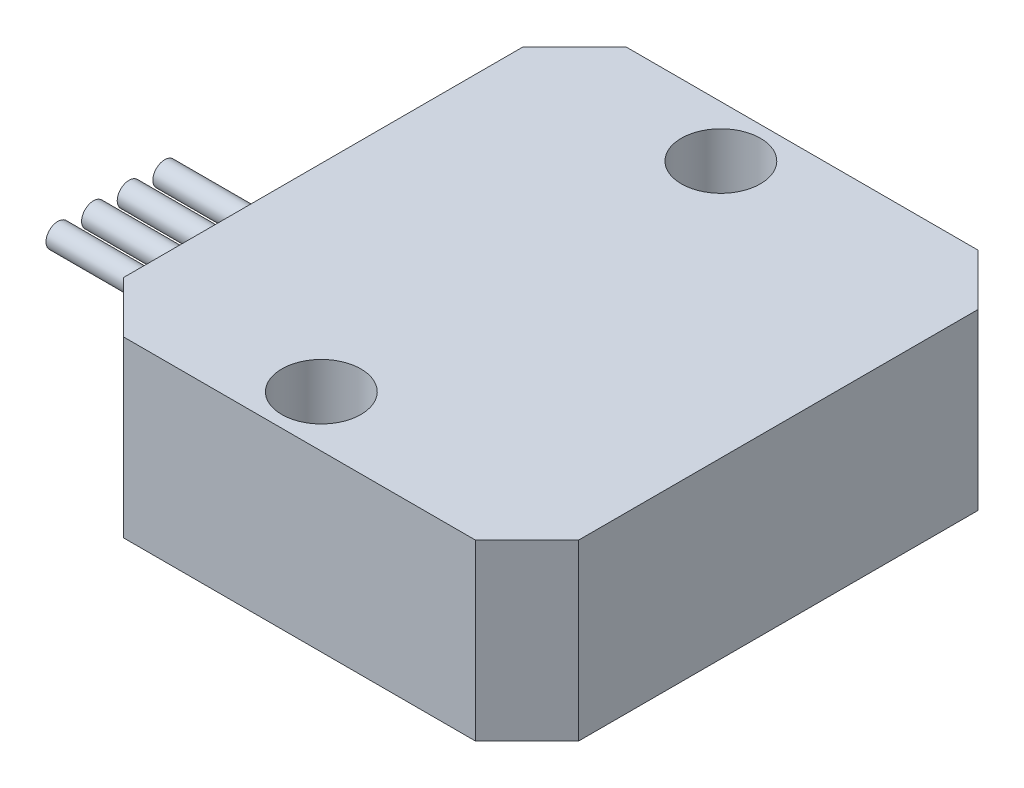
ISO-10303-21;
HEADER;
FILE_DESCRIPTION(('STEP AP214'),'2;1');
FILE_NAME('part.step','',(''),(''),'','','');
FILE_SCHEMA(('AUTOMOTIVE_DESIGN { 1 0 10303 214 1 1 1 1 }'));
ENDSEC;
DATA;
#1=APPLICATION_CONTEXT('core data for automotive mechanical design processes');
#2=APPLICATION_PROTOCOL_DEFINITION('international standard','automotive_design',2000,#1);
#3=PRODUCT_CONTEXT('',#1,'mechanical');
#4=PRODUCT('Part','Part','',(#3));
#5=PRODUCT_RELATED_PRODUCT_CATEGORY('part','',(#4));
#6=PRODUCT_DEFINITION_FORMATION('','',#4);
#7=PRODUCT_DEFINITION_CONTEXT('part definition',#1,'design');
#8=PRODUCT_DEFINITION('design','',#6,#7);
#9=PRODUCT_DEFINITION_SHAPE('','',#8);
#10=(LENGTH_UNIT() NAMED_UNIT(*) SI_UNIT(.MILLI.,.METRE.));
#11=(NAMED_UNIT(*) PLANE_ANGLE_UNIT() SI_UNIT($,.RADIAN.));
#12=(NAMED_UNIT(*) SI_UNIT($,.STERADIAN.) SOLID_ANGLE_UNIT());
#13=UNCERTAINTY_MEASURE_WITH_UNIT(LENGTH_MEASURE(1.E-05),#10,'distance_accuracy_value','');
#14=(GEOMETRIC_REPRESENTATION_CONTEXT(3) GLOBAL_UNCERTAINTY_ASSIGNED_CONTEXT((#13)) GLOBAL_UNIT_ASSIGNED_CONTEXT((#10,
#11,#12)) REPRESENTATION_CONTEXT('',''));
#15=CARTESIAN_POINT('',(0.,0.,0.));
#16=DIRECTION('',(0.,0.,1.));
#17=DIRECTION('',(1.,0.,0.));
#18=AXIS2_PLACEMENT_3D('',#15,#16,#17);
#19=CARTESIAN_POINT('',(-28.75,22.,25.25));
#20=DIRECTION('',(1.,0.,0.));
#21=DIRECTION('',(0.,0.,-1.));
#22=AXIS2_PLACEMENT_3D('',#19,#20,#21);
#23=PLANE('',#22);
#24=DIRECTION('',(0.,-1.,0.));
#25=VECTOR('',#24,1.);
#26=CARTESIAN_POINT('',(-28.75,0.,-13.75));
#27=LINE('',#26,#25);
#28=CARTESIAN_POINT('',(-28.75,14.5,-13.75));
#29=VERTEX_POINT('',#28);
#30=CARTESIAN_POINT('',(-28.75,0.,-13.75));
#31=VERTEX_POINT('',#30);
#32=EDGE_CURVE('E52',#29,#31,#27,.T.);
#33=ORIENTED_EDGE('',*,*,#32,.F.);
#34=DIRECTION('',(0.,0.,-1.));
#35=VECTOR('',#34,1.);
#36=CARTESIAN_POINT('',(-28.75,14.5,-13.75));
#37=LINE('',#36,#35);
#38=CARTESIAN_POINT('',(-28.75,14.5,13.75));
#39=VERTEX_POINT('',#38);
#40=EDGE_CURVE('E147',#39,#29,#37,.T.);
#41=ORIENTED_EDGE('',*,*,#40,.F.);
#42=DIRECTION('',(0.,1.,0.));
#43=VECTOR('',#42,1.);
#44=CARTESIAN_POINT('',(-28.75,0.,13.75));
#45=LINE('',#44,#43);
#46=CARTESIAN_POINT('',(-28.75,0.,13.75));
#47=VERTEX_POINT('',#46);
#48=EDGE_CURVE('E58',#47,#39,#45,.T.);
#49=ORIENTED_EDGE('',*,*,#48,.F.);
#50=DIRECTION('',(0.,0.,1.));
#51=VECTOR('',#50,1.);
#52=CARTESIAN_POINT('',(-28.75,0.,25.25));
#53=LINE('',#52,#51);
#54=CARTESIAN_POINT('',(-28.75,0.,25.25));
#55=VERTEX_POINT('',#54);
#56=EDGE_CURVE('E197',#47,#55,#53,.T.);
#57=ORIENTED_EDGE('',*,*,#56,.T.);
#58=DIRECTION('',(0.,-1.,0.));
#59=VECTOR('',#58,1.);
#60=CARTESIAN_POINT('',(-28.75,22.,25.25));
#61=LINE('',#60,#59);
#62=CARTESIAN_POINT('',(-28.75,22.,25.25));
#63=VERTEX_POINT('',#62);
#64=EDGE_CURVE('E208',#63,#55,#61,.T.);
#65=ORIENTED_EDGE('',*,*,#64,.F.);
#66=DIRECTION('',(0.,0.,1.));
#67=VECTOR('',#66,1.);
#68=CARTESIAN_POINT('',(-28.75,22.,25.25));
#69=LINE('',#68,#67);
#70=CARTESIAN_POINT('',(-28.75,22.,-25.25));
#71=VERTEX_POINT('',#70);
#72=EDGE_CURVE('E180',#71,#63,#69,.T.);
#73=ORIENTED_EDGE('',*,*,#72,.F.);
#74=DIRECTION('',(0.,-1.,0.));
#75=VECTOR('',#74,1.);
#76=CARTESIAN_POINT('',(-28.75,22.,-25.25));
#77=LINE('',#76,#75);
#78=CARTESIAN_POINT('',(-28.75,0.,-25.25));
#79=VERTEX_POINT('',#78);
#80=EDGE_CURVE('E211',#71,#79,#77,.T.);
#81=ORIENTED_EDGE('',*,*,#80,.T.);
#82=EDGE_CURVE('E198',#79,#31,#53,.T.);
#83=ORIENTED_EDGE('',*,*,#82,.T.);
#84=EDGE_LOOP('',(#33,#41,#49,#57,#65,#73,#81,#83));
#85=FACE_BOUND('',#84,.T.);
#86=ADVANCED_FACE('F37',(#85),#23,.F.);
#87=CARTESIAN_POINT('',(0.,22.,0.));
#88=DIRECTION('',(0.,-1.,0.));
#89=DIRECTION('',(0.,0.,-1.));
#90=AXIS2_PLACEMENT_3D('',#87,#88,#89);
#91=PLANE('',#90);
#92=DIRECTION('',(0.707106781186548,0.,-0.707106781186547));
#93=VECTOR('',#92,1.);
#94=CARTESIAN_POINT('',(28.75,22.,25.25));
#95=LINE('',#94,#93);
#96=CARTESIAN_POINT('',(22.25,22.,31.75));
#97=VERTEX_POINT('',#96);
#98=CARTESIAN_POINT('',(28.75,22.,25.25));
#99=VERTEX_POINT('',#98);
#100=EDGE_CURVE('E168',#97,#99,#95,.T.);
#101=ORIENTED_EDGE('',*,*,#100,.T.);
#102=DIRECTION('',(0.,0.,-1.));
#103=VECTOR('',#102,1.);
#104=CARTESIAN_POINT('',(28.75,22.,-25.25));
#105=LINE('',#104,#103);
#106=CARTESIAN_POINT('',(28.75,22.,-25.25));
#107=VERTEX_POINT('',#106);
#108=EDGE_CURVE('E171',#99,#107,#105,.T.);
#109=ORIENTED_EDGE('',*,*,#108,.T.);
#110=DIRECTION('',(-0.707106781186544,0.,-0.707106781186551));
#111=VECTOR('',#110,1.);
#112=CARTESIAN_POINT('',(22.25,22.,-31.75));
#113=LINE('',#112,#111);
#114=CARTESIAN_POINT('',(22.25,22.,-31.75));
#115=VERTEX_POINT('',#114);
#116=EDGE_CURVE('E174',#107,#115,#113,.T.);
#117=ORIENTED_EDGE('',*,*,#116,.T.);
#118=DIRECTION('',(-1.,0.,0.));
#119=VECTOR('',#118,1.);
#120=CARTESIAN_POINT('',(-22.2499999999999,22.,-31.75));
#121=LINE('',#120,#119);
#122=CARTESIAN_POINT('',(-22.2499999999999,22.,-31.75));
#123=VERTEX_POINT('',#122);
#124=EDGE_CURVE('E176',#115,#123,#121,.T.);
#125=ORIENTED_EDGE('',*,*,#124,.T.);
#126=DIRECTION('',(-0.707106781186551,0.,0.707106781186544));
#127=VECTOR('',#126,1.);
#128=CARTESIAN_POINT('',(-28.75,22.,-25.25));
#129=LINE('',#128,#127);
#130=EDGE_CURVE('E178',#123,#71,#129,.T.);
#131=ORIENTED_EDGE('',*,*,#130,.T.);
#132=ORIENTED_EDGE('',*,*,#72,.T.);
#133=DIRECTION('',(0.707106781186545,0.,0.70710678118655));
#134=VECTOR('',#133,1.);
#135=CARTESIAN_POINT('',(-22.25,22.,31.75));
#136=LINE('',#135,#134);
#137=CARTESIAN_POINT('',(-22.25,22.,31.75));
#138=VERTEX_POINT('',#137);
#139=EDGE_CURVE('E182',#63,#138,#136,.T.);
#140=ORIENTED_EDGE('',*,*,#139,.T.);
#141=DIRECTION('',(1.,0.,0.));
#142=VECTOR('',#141,1.);
#143=CARTESIAN_POINT('',(22.25,22.,31.75));
#144=LINE('',#143,#142);
#145=EDGE_CURVE('E184',#138,#97,#144,.T.);
#146=ORIENTED_EDGE('',*,*,#145,.T.);
#147=EDGE_LOOP('',(#101,#109,#117,#125,#131,#132,#140,#146));
#148=FACE_BOUND('',#147,.T.);
#149=CARTESIAN_POINT('',(-3.74999999999999,22.,-25.25));
#150=DIRECTION('',(0.,1.,0.));
#151=DIRECTION('',(0.,0.,1.));
#152=AXIS2_PLACEMENT_3D('',#149,#150,#151);
#153=CIRCLE('',#152,5.);
#154=CARTESIAN_POINT('',(-3.74999999999999,22.,-20.25));
#155=VERTEX_POINT('',#154);
#156=EDGE_CURVE('E162',#155,#155,#153,.T.);
#157=ORIENTED_EDGE('',*,*,#156,.F.);
#158=EDGE_LOOP('',(#157));
#159=FACE_BOUND('',#158,.T.);
#160=CARTESIAN_POINT('',(-3.74999999999998,22.,25.25));
#161=DIRECTION('',(0.,1.,0.));
#162=DIRECTION('',(0.,0.,1.));
#163=AXIS2_PLACEMENT_3D('',#160,#161,#162);
#164=CIRCLE('',#163,5.);
#165=CARTESIAN_POINT('',(-3.74999999999998,22.,30.25));
#166=VERTEX_POINT('',#165);
#167=EDGE_CURVE('E153',#166,#166,#164,.T.);
#168=ORIENTED_EDGE('',*,*,#167,.F.);
#169=EDGE_LOOP('',(#168));
#170=FACE_BOUND('',#169,.T.);
#171=ADVANCED_FACE('F259',(#148,#159,#170),#91,.F.);
#172=CARTESIAN_POINT('',(0.,0.,0.));
#173=DIRECTION('',(0.,-1.,0.));
#174=DIRECTION('',(0.,0.,-1.));
#175=AXIS2_PLACEMENT_3D('',#172,#173,#174);
#176=PLANE('',#175);
#177=CARTESIAN_POINT('',(-3.74999999999999,0.,-25.25));
#178=DIRECTION('',(0.,1.,0.));
#179=DIRECTION('',(0.,0.,1.));
#180=AXIS2_PLACEMENT_3D('',#177,#178,#179);
#181=CIRCLE('',#180,5.);
#182=CARTESIAN_POINT('',(-3.74999999999999,0.,-20.25));
#183=VERTEX_POINT('',#182);
#184=EDGE_CURVE('E160',#183,#183,#181,.T.);
#185=ORIENTED_EDGE('',*,*,#184,.T.);
#186=EDGE_LOOP('',(#185));
#187=FACE_BOUND('',#186,.T.);
#188=DIRECTION('',(0.707106781186548,0.,-0.707106781186547));
#189=VECTOR('',#188,1.);
#190=CARTESIAN_POINT('',(28.75,0.,25.25));
#191=LINE('',#190,#189);
#192=CARTESIAN_POINT('',(22.25,0.,31.75));
#193=VERTEX_POINT('',#192);
#194=CARTESIAN_POINT('',(28.75,0.,25.25));
#195=VERTEX_POINT('',#194);
#196=EDGE_CURVE('E165',#193,#195,#191,.T.);
#197=ORIENTED_EDGE('',*,*,#196,.F.);
#198=DIRECTION('',(1.,0.,0.));
#199=VECTOR('',#198,1.);
#200=CARTESIAN_POINT('',(22.25,0.,31.75));
#201=LINE('',#200,#199);
#202=CARTESIAN_POINT('',(-22.25,0.,31.75));
#203=VERTEX_POINT('',#202);
#204=EDGE_CURVE('E172',#203,#193,#201,.T.);
#205=ORIENTED_EDGE('',*,*,#204,.F.);
#206=DIRECTION('',(0.707106781186545,0.,0.70710678118655));
#207=VECTOR('',#206,1.);
#208=CARTESIAN_POINT('',(-22.25,0.,31.75));
#209=LINE('',#208,#207);
#210=EDGE_CURVE('E200',#55,#203,#209,.T.);
#211=ORIENTED_EDGE('',*,*,#210,.F.);
#212=ORIENTED_EDGE('',*,*,#56,.F.);
#213=DIRECTION('',(1.,0.,0.));
#214=VECTOR('',#213,1.);
#215=CARTESIAN_POINT('',(-30.55,0.,13.75));
#216=LINE('',#215,#214);
#217=CARTESIAN_POINT('',(-30.55,0.,13.75));
#218=VERTEX_POINT('',#217);
#219=EDGE_CURVE('E134',#218,#47,#216,.T.);
#220=ORIENTED_EDGE('',*,*,#219,.F.);
#221=DIRECTION('',(0.,0.,1.));
#222=VECTOR('',#221,1.);
#223=CARTESIAN_POINT('',(-30.55,0.,-13.75));
#224=LINE('',#223,#222);
#225=CARTESIAN_POINT('',(-30.55,0.,-13.75));
#226=VERTEX_POINT('',#225);
#227=EDGE_CURVE('E125',#226,#218,#224,.T.);
#228=ORIENTED_EDGE('',*,*,#227,.F.);
#229=DIRECTION('',(1.,0.,0.));
#230=VECTOR('',#229,1.);
#231=CARTESIAN_POINT('',(-30.55,0.,-13.75));
#232=LINE('',#231,#230);
#233=EDGE_CURVE('E132',#226,#31,#232,.T.);
#234=ORIENTED_EDGE('',*,*,#233,.T.);
#235=ORIENTED_EDGE('',*,*,#82,.F.);
#236=DIRECTION('',(-0.707106781186551,0.,0.707106781186544));
#237=VECTOR('',#236,1.);
#238=CARTESIAN_POINT('',(-28.75,0.,-25.25));
#239=LINE('',#238,#237);
#240=CARTESIAN_POINT('',(-22.2499999999999,0.,-31.75));
#241=VERTEX_POINT('',#240);
#242=EDGE_CURVE('E195',#241,#79,#239,.T.);
#243=ORIENTED_EDGE('',*,*,#242,.F.);
#244=DIRECTION('',(-1.,0.,0.));
#245=VECTOR('',#244,1.);
#246=CARTESIAN_POINT('',(-22.2499999999999,0.,-31.75));
#247=LINE('',#246,#245);
#248=CARTESIAN_POINT('',(22.25,0.,-31.75));
#249=VERTEX_POINT('',#248);
#250=EDGE_CURVE('E193',#249,#241,#247,.T.);
#251=ORIENTED_EDGE('',*,*,#250,.F.);
#252=DIRECTION('',(-0.707106781186544,0.,-0.707106781186551));
#253=VECTOR('',#252,1.);
#254=CARTESIAN_POINT('',(22.25,0.,-31.75));
#255=LINE('',#254,#253);
#256=CARTESIAN_POINT('',(28.75,0.,-25.25));
#257=VERTEX_POINT('',#256);
#258=EDGE_CURVE('E191',#257,#249,#255,.T.);
#259=ORIENTED_EDGE('',*,*,#258,.F.);
#260=DIRECTION('',(0.,0.,-1.));
#261=VECTOR('',#260,1.);
#262=CARTESIAN_POINT('',(28.75,0.,-25.25));
#263=LINE('',#262,#261);
#264=EDGE_CURVE('E189',#195,#257,#263,.T.);
#265=ORIENTED_EDGE('',*,*,#264,.F.);
#266=EDGE_LOOP('',(#197,#205,#211,#212,#220,#228,#234,#235,#243,#251,#259,#265));
#267=FACE_BOUND('',#266,.T.);
#268=CARTESIAN_POINT('',(-3.74999999999998,0.,25.25));
#269=DIRECTION('',(0.,1.,0.));
#270=DIRECTION('',(0.,0.,1.));
#271=AXIS2_PLACEMENT_3D('',#268,#269,#270);
#272=CIRCLE('',#271,5.);
#273=CARTESIAN_POINT('',(-3.74999999999998,0.,30.25));
#274=VERTEX_POINT('',#273);
#275=EDGE_CURVE('E150',#274,#274,#272,.T.);
#276=ORIENTED_EDGE('',*,*,#275,.T.);
#277=EDGE_LOOP('',(#276));
#278=FACE_BOUND('',#277,.T.);
#279=ADVANCED_FACE('F128',(#187,#267,#278),#176,.T.);
#280=CARTESIAN_POINT('',(28.75,22.,25.25));
#281=DIRECTION('',(-0.707106781186547,0.,-0.707106781186548));
#282=DIRECTION('',(-0.707106781186548,0.,0.707106781186547));
#283=AXIS2_PLACEMENT_3D('',#280,#281,#282);
#284=PLANE('',#283);
#285=ORIENTED_EDGE('',*,*,#196,.T.);
#286=DIRECTION('',(0.,-1.,0.));
#287=VECTOR('',#286,1.);
#288=CARTESIAN_POINT('',(28.75,22.,25.25));
#289=LINE('',#288,#287);
#290=EDGE_CURVE('E223',#99,#195,#289,.T.);
#291=ORIENTED_EDGE('',*,*,#290,.F.);
#292=ORIENTED_EDGE('',*,*,#100,.F.);
#293=DIRECTION('',(0.,-1.,0.));
#294=VECTOR('',#293,1.);
#295=CARTESIAN_POINT('',(22.25,22.,31.75));
#296=LINE('',#295,#294);
#297=EDGE_CURVE('E186',#97,#193,#296,.T.);
#298=ORIENTED_EDGE('',*,*,#297,.T.);
#299=EDGE_LOOP('',(#285,#291,#292,#298));
#300=FACE_BOUND('',#299,.T.);
#301=ADVANCED_FACE('F39',(#300),#284,.F.);
#302=CARTESIAN_POINT('',(28.75,22.,-25.25));
#303=DIRECTION('',(-1.,0.,0.));
#304=DIRECTION('',(0.,0.,1.));
#305=AXIS2_PLACEMENT_3D('',#302,#303,#304);
#306=PLANE('',#305);
#307=ORIENTED_EDGE('',*,*,#264,.T.);
#308=DIRECTION('',(0.,-1.,0.));
#309=VECTOR('',#308,1.);
#310=CARTESIAN_POINT('',(28.75,22.,-25.25));
#311=LINE('',#310,#309);
#312=EDGE_CURVE('E220',#107,#257,#311,.T.);
#313=ORIENTED_EDGE('',*,*,#312,.F.);
#314=ORIENTED_EDGE('',*,*,#108,.F.);
#315=ORIENTED_EDGE('',*,*,#290,.T.);
#316=EDGE_LOOP('',(#307,#313,#314,#315));
#317=FACE_BOUND('',#316,.T.);
#318=ADVANCED_FACE('F282',(#317),#306,.F.);
#319=CARTESIAN_POINT('',(22.25,22.,-31.75));
#320=DIRECTION('',(-0.707106781186551,0.,0.707106781186544));
#321=DIRECTION('',(0.707106781186544,0.,0.707106781186551));
#322=AXIS2_PLACEMENT_3D('',#319,#320,#321);
#323=PLANE('',#322);
#324=ORIENTED_EDGE('',*,*,#258,.T.);
#325=DIRECTION('',(0.,-1.,0.));
#326=VECTOR('',#325,1.);
#327=CARTESIAN_POINT('',(22.25,22.,-31.75));
#328=LINE('',#327,#326);
#329=EDGE_CURVE('E217',#115,#249,#328,.T.);
#330=ORIENTED_EDGE('',*,*,#329,.F.);
#331=ORIENTED_EDGE('',*,*,#116,.F.);
#332=ORIENTED_EDGE('',*,*,#312,.T.);
#333=EDGE_LOOP('',(#324,#330,#331,#332));
#334=FACE_BOUND('',#333,.T.);
#335=ADVANCED_FACE('F279',(#334),#323,.F.);
#336=CARTESIAN_POINT('',(-22.2499999999999,22.,-31.75));
#337=DIRECTION('',(0.,0.,1.));
#338=DIRECTION('',(1.,0.,0.));
#339=AXIS2_PLACEMENT_3D('',#336,#337,#338);
#340=PLANE('',#339);
#341=ORIENTED_EDGE('',*,*,#250,.T.);
#342=DIRECTION('',(0.,-1.,0.));
#343=VECTOR('',#342,1.);
#344=CARTESIAN_POINT('',(-22.2499999999999,22.,-31.75));
#345=LINE('',#344,#343);
#346=EDGE_CURVE('E214',#123,#241,#345,.T.);
#347=ORIENTED_EDGE('',*,*,#346,.F.);
#348=ORIENTED_EDGE('',*,*,#124,.F.);
#349=ORIENTED_EDGE('',*,*,#329,.T.);
#350=EDGE_LOOP('',(#341,#347,#348,#349));
#351=FACE_BOUND('',#350,.T.);
#352=ADVANCED_FACE('F275',(#351),#340,.F.);
#353=CARTESIAN_POINT('',(-28.75,22.,-25.25));
#354=DIRECTION('',(0.707106781186544,0.,0.707106781186551));
#355=DIRECTION('',(0.707106781186551,0.,-0.707106781186544));
#356=AXIS2_PLACEMENT_3D('',#353,#354,#355);
#357=PLANE('',#356);
#358=ORIENTED_EDGE('',*,*,#242,.T.);
#359=ORIENTED_EDGE('',*,*,#80,.F.);
#360=ORIENTED_EDGE('',*,*,#130,.F.);
#361=ORIENTED_EDGE('',*,*,#346,.T.);
#362=EDGE_LOOP('',(#358,#359,#360,#361));
#363=FACE_BOUND('',#362,.T.);
#364=ADVANCED_FACE('F272',(#363),#357,.F.);
#365=CARTESIAN_POINT('',(-22.25,22.,31.75));
#366=DIRECTION('',(0.70710678118655,0.,-0.707106781186545));
#367=DIRECTION('',(-0.707106781186545,0.,-0.70710678118655));
#368=AXIS2_PLACEMENT_3D('',#365,#366,#367);
#369=PLANE('',#368);
#370=ORIENTED_EDGE('',*,*,#210,.T.);
#371=DIRECTION('',(0.,-1.,0.));
#372=VECTOR('',#371,1.);
#373=CARTESIAN_POINT('',(-22.25,22.,31.75));
#374=LINE('',#373,#372);
#375=EDGE_CURVE('E205',#138,#203,#374,.T.);
#376=ORIENTED_EDGE('',*,*,#375,.F.);
#377=ORIENTED_EDGE('',*,*,#139,.F.);
#378=ORIENTED_EDGE('',*,*,#64,.T.);
#379=EDGE_LOOP('',(#370,#376,#377,#378));
#380=FACE_BOUND('',#379,.T.);
#381=ADVANCED_FACE('F270',(#380),#369,.F.);
#382=CARTESIAN_POINT('',(22.25,22.,31.75));
#383=DIRECTION('',(0.,0.,-1.));
#384=DIRECTION('',(-1.,0.,0.));
#385=AXIS2_PLACEMENT_3D('',#382,#383,#384);
#386=PLANE('',#385);
#387=ORIENTED_EDGE('',*,*,#204,.T.);
#388=ORIENTED_EDGE('',*,*,#297,.F.);
#389=ORIENTED_EDGE('',*,*,#145,.F.);
#390=ORIENTED_EDGE('',*,*,#375,.T.);
#391=EDGE_LOOP('',(#387,#388,#389,#390));
#392=FACE_BOUND('',#391,.T.);
#393=ADVANCED_FACE('F310',(#392),#386,.F.);
#394=CARTESIAN_POINT('',(-3.74999999999999,22.,-25.25));
#395=DIRECTION('',(0.,-1.,0.));
#396=DIRECTION('',(0.,0.,-1.));
#397=AXIS2_PLACEMENT_3D('',#394,#395,#396);
#398=CYLINDRICAL_SURFACE('',#397,5.);
#399=ORIENTED_EDGE('',*,*,#156,.T.);
#400=EDGE_LOOP('',(#399));
#401=FACE_BOUND('',#400,.T.);
#402=ORIENTED_EDGE('',*,*,#184,.F.);
#403=EDGE_LOOP('',(#402));
#404=FACE_BOUND('',#403,.T.);
#405=ADVANCED_FACE('F339',(#401,#404),#398,.F.);
#406=CARTESIAN_POINT('',(-3.74999999999998,22.,25.25));
#407=DIRECTION('',(0.,-1.,0.));
#408=DIRECTION('',(0.,0.,-1.));
#409=AXIS2_PLACEMENT_3D('',#406,#407,#408);
#410=CYLINDRICAL_SURFACE('',#409,5.);
#411=ORIENTED_EDGE('',*,*,#167,.T.);
#412=EDGE_LOOP('',(#411));
#413=FACE_BOUND('',#412,.T.);
#414=ORIENTED_EDGE('',*,*,#275,.F.);
#415=EDGE_LOOP('',(#414));
#416=FACE_BOUND('',#415,.T.);
#417=ADVANCED_FACE('F336',(#413,#416),#410,.F.);
#418=CARTESIAN_POINT('',(-30.55,0.,-13.75));
#419=DIRECTION('',(0.,0.,1.));
#420=DIRECTION('',(1.,0.,0.));
#421=AXIS2_PLACEMENT_3D('',#418,#419,#420);
#422=PLANE('',#421);
#423=ORIENTED_EDGE('',*,*,#32,.T.);
#424=ORIENTED_EDGE('',*,*,#233,.F.);
#425=DIRECTION('',(0.,-1.,0.));
#426=VECTOR('',#425,1.);
#427=CARTESIAN_POINT('',(-30.55,0.,-13.75));
#428=LINE('',#427,#426);
#429=CARTESIAN_POINT('',(-30.55,14.5,-13.75));
#430=VERTEX_POINT('',#429);
#431=EDGE_CURVE('E138',#430,#226,#428,.T.);
#432=ORIENTED_EDGE('',*,*,#431,.F.);
#433=DIRECTION('',(1.,0.,0.));
#434=VECTOR('',#433,1.);
#435=CARTESIAN_POINT('',(-30.55,14.5,-13.75));
#436=LINE('',#435,#434);
#437=EDGE_CURVE('E319',#430,#29,#436,.T.);
#438=ORIENTED_EDGE('',*,*,#437,.T.);
#439=EDGE_LOOP('',(#423,#424,#432,#438));
#440=FACE_BOUND('',#439,.T.);
#441=ADVANCED_FACE('F149',(#440),#422,.F.);
#442=CARTESIAN_POINT('',(-30.55,0.,13.75));
#443=DIRECTION('',(0.,0.,-1.));
#444=DIRECTION('',(0.,1.,0.));
#445=AXIS2_PLACEMENT_3D('',#442,#443,#444);
#446=PLANE('',#445);
#447=ORIENTED_EDGE('',*,*,#48,.T.);
#448=DIRECTION('',(1.,0.,0.));
#449=VECTOR('',#448,1.);
#450=CARTESIAN_POINT('',(-30.55,14.5,13.75));
#451=LINE('',#450,#449);
#452=CARTESIAN_POINT('',(-30.55,14.5,13.75));
#453=VERTEX_POINT('',#452);
#454=EDGE_CURVE('E155',#453,#39,#451,.T.);
#455=ORIENTED_EDGE('',*,*,#454,.F.);
#456=DIRECTION('',(0.,1.,0.));
#457=VECTOR('',#456,1.);
#458=CARTESIAN_POINT('',(-30.55,0.,13.75));
#459=LINE('',#458,#457);
#460=EDGE_CURVE('E137',#218,#453,#459,.T.);
#461=ORIENTED_EDGE('',*,*,#460,.F.);
#462=ORIENTED_EDGE('',*,*,#219,.T.);
#463=EDGE_LOOP('',(#447,#455,#461,#462));
#464=FACE_BOUND('',#463,.T.);
#465=ADVANCED_FACE('F315',(#464),#446,.F.);
#466=CARTESIAN_POINT('',(-30.55,14.5,-13.75));
#467=DIRECTION('',(0.,-1.,0.));
#468=DIRECTION('',(0.,0.,-1.));
#469=AXIS2_PLACEMENT_3D('',#466,#467,#468);
#470=PLANE('',#469);
#471=ORIENTED_EDGE('',*,*,#40,.T.);
#472=ORIENTED_EDGE('',*,*,#437,.F.);
#473=DIRECTION('',(0.,0.,-1.));
#474=VECTOR('',#473,1.);
#475=CARTESIAN_POINT('',(-30.55,14.5,-13.75));
#476=LINE('',#475,#474);
#477=EDGE_CURVE('E143',#453,#430,#476,.T.);
#478=ORIENTED_EDGE('',*,*,#477,.F.);
#479=ORIENTED_EDGE('',*,*,#454,.T.);
#480=EDGE_LOOP('',(#471,#472,#478,#479));
#481=FACE_BOUND('',#480,.T.);
#482=ADVANCED_FACE('F240',(#481),#470,.F.);
#483=CARTESIAN_POINT('',(-30.55,0.,0.));
#484=DIRECTION('',(1.,0.,0.));
#485=DIRECTION('',(0.,0.,-1.));
#486=AXIS2_PLACEMENT_3D('',#483,#484,#485);
#487=PLANE('',#486);
#488=CARTESIAN_POINT('',(-30.55,4.,6.75000000000001));
#489=DIRECTION('',(1.,0.,0.));
#490=DIRECTION('',(0.,0.,-1.));
#491=AXIS2_PLACEMENT_3D('',#488,#489,#490);
#492=CIRCLE('',#491,1.5);
#493=CARTESIAN_POINT('',(-30.55,4.,5.25000000000001));
#494=VERTEX_POINT('',#493);
#495=EDGE_CURVE('E11',#494,#494,#492,.F.);
#496=ORIENTED_EDGE('',*,*,#495,.F.);
#497=EDGE_LOOP('',(#496));
#498=FACE_BOUND('',#497,.T.);
#499=CARTESIAN_POINT('',(-30.55,4.,-6.74999999999999));
#500=DIRECTION('',(1.,0.,0.));
#501=DIRECTION('',(0.,0.,-1.));
#502=AXIS2_PLACEMENT_3D('',#499,#500,#501);
#503=CIRCLE('',#502,1.5);
#504=CARTESIAN_POINT('',(-30.55,4.,-8.24999999999999));
#505=VERTEX_POINT('',#504);
#506=EDGE_CURVE('E45',#505,#505,#503,.F.);
#507=ORIENTED_EDGE('',*,*,#506,.F.);
#508=EDGE_LOOP('',(#507));
#509=FACE_BOUND('',#508,.T.);
#510=CARTESIAN_POINT('',(-30.55,4.,2.25000000000001));
#511=DIRECTION('',(1.,0.,0.));
#512=DIRECTION('',(0.,0.,-1.));
#513=AXIS2_PLACEMENT_3D('',#510,#511,#512);
#514=CIRCLE('',#513,1.5);
#515=CARTESIAN_POINT('',(-30.55,4.,0.750000000000008));
#516=VERTEX_POINT('',#515);
#517=EDGE_CURVE('E229',#516,#516,#514,.F.);
#518=ORIENTED_EDGE('',*,*,#517,.F.);
#519=EDGE_LOOP('',(#518));
#520=FACE_BOUND('',#519,.T.);
#521=CARTESIAN_POINT('',(-30.55,4.,-2.24999999999999));
#522=DIRECTION('',(1.,0.,0.));
#523=DIRECTION('',(0.,0.,-1.));
#524=AXIS2_PLACEMENT_3D('',#521,#522,#523);
#525=CIRCLE('',#524,1.5);
#526=CARTESIAN_POINT('',(-30.55,4.,-3.74999999999999));
#527=VERTEX_POINT('',#526);
#528=EDGE_CURVE('E226',#527,#527,#525,.F.);
#529=ORIENTED_EDGE('',*,*,#528,.F.);
#530=EDGE_LOOP('',(#529));
#531=FACE_BOUND('',#530,.T.);
#532=ORIENTED_EDGE('',*,*,#431,.T.);
#533=ORIENTED_EDGE('',*,*,#227,.T.);
#534=ORIENTED_EDGE('',*,*,#460,.T.);
#535=ORIENTED_EDGE('',*,*,#477,.T.);
#536=EDGE_LOOP('',(#532,#533,#534,#535));
#537=FACE_BOUND('',#536,.T.);
#538=ADVANCED_FACE('F141',(#498,#509,#520,#531,#537),#487,.F.);
#539=CARTESIAN_POINT('',(-55.55,4.,-2.24999999999998));
#540=DIRECTION('',(1.,0.,0.));
#541=DIRECTION('',(0.,0.,-1.));
#542=AXIS2_PLACEMENT_3D('',#539,#540,#541);
#543=CYLINDRICAL_SURFACE('',#542,1.5);
#544=CARTESIAN_POINT('',(-55.55,4.,-2.24999999999998));
#545=DIRECTION('',(-1.,0.,0.));
#546=DIRECTION('',(0.,0.,1.));
#547=AXIS2_PLACEMENT_3D('',#544,#545,#546);
#548=CIRCLE('',#547,1.5);
#549=CARTESIAN_POINT('',(-55.55,4.,-0.749999999999984));
#550=VERTEX_POINT('',#549);
#551=EDGE_CURVE('E323',#550,#550,#548,.T.);
#552=ORIENTED_EDGE('',*,*,#551,.F.);
#553=EDGE_LOOP('',(#552));
#554=FACE_BOUND('',#553,.T.);
#555=ORIENTED_EDGE('',*,*,#528,.T.);
#556=EDGE_LOOP('',(#555));
#557=FACE_BOUND('',#556,.T.);
#558=ADVANCED_FACE('F239',(#554,#557),#543,.T.);
#559=CARTESIAN_POINT('',(-55.55,4.,-2.24999999999998));
#560=DIRECTION('',(-1.,0.,0.));
#561=DIRECTION('',(0.,0.,1.));
#562=AXIS2_PLACEMENT_3D('',#559,#560,#561);
#563=PLANE('',#562);
#564=ORIENTED_EDGE('',*,*,#551,.T.);
#565=EDGE_LOOP('',(#564));
#566=FACE_BOUND('',#565,.T.);
#567=ADVANCED_FACE('F248',(#566),#563,.T.);
#568=CARTESIAN_POINT('',(-55.55,4.,2.25000000000002));
#569=DIRECTION('',(1.,0.,0.));
#570=DIRECTION('',(0.,0.,-1.));
#571=AXIS2_PLACEMENT_3D('',#568,#569,#570);
#572=CYLINDRICAL_SURFACE('',#571,1.5);
#573=CARTESIAN_POINT('',(-55.55,4.,2.25000000000002));
#574=DIRECTION('',(-1.,0.,0.));
#575=DIRECTION('',(0.,0.,1.));
#576=AXIS2_PLACEMENT_3D('',#573,#574,#575);
#577=CIRCLE('',#576,1.5);
#578=CARTESIAN_POINT('',(-55.55,4.,3.75000000000002));
#579=VERTEX_POINT('',#578);
#580=EDGE_CURVE('E520',#579,#579,#577,.T.);
#581=ORIENTED_EDGE('',*,*,#580,.F.);
#582=EDGE_LOOP('',(#581));
#583=FACE_BOUND('',#582,.T.);
#584=ORIENTED_EDGE('',*,*,#517,.T.);
#585=EDGE_LOOP('',(#584));
#586=FACE_BOUND('',#585,.T.);
#587=ADVANCED_FACE('F254',(#583,#586),#572,.T.);
#588=CARTESIAN_POINT('',(-55.55,4.,2.25000000000002));
#589=DIRECTION('',(-1.,0.,0.));
#590=DIRECTION('',(0.,0.,1.));
#591=AXIS2_PLACEMENT_3D('',#588,#589,#590);
#592=PLANE('',#591);
#593=ORIENTED_EDGE('',*,*,#580,.T.);
#594=EDGE_LOOP('',(#593));
#595=FACE_BOUND('',#594,.T.);
#596=ADVANCED_FACE('F452',(#595),#592,.T.);
#597=CARTESIAN_POINT('',(-59.7926406871193,4.,-6.74999999999998));
#598=DIRECTION('',(1.,0.,0.));
#599=DIRECTION('',(0.,0.,-1.));
#600=AXIS2_PLACEMENT_3D('',#597,#598,#599);
#601=CYLINDRICAL_SURFACE('',#600,1.5);
#602=ORIENTED_EDGE('',*,*,#506,.T.);
#603=EDGE_LOOP('',(#602));
#604=FACE_BOUND('',#603,.T.);
#605=CARTESIAN_POINT('',(-55.55,4.,-6.74999999999998));
#606=DIRECTION('',(-1.,0.,0.));
#607=DIRECTION('',(0.,0.,1.));
#608=AXIS2_PLACEMENT_3D('',#605,#606,#607);
#609=CIRCLE('',#608,1.5);
#610=CARTESIAN_POINT('',(-55.55,4.,-5.24999999999998));
#611=VERTEX_POINT('',#610);
#612=EDGE_CURVE('E517',#611,#611,#609,.T.);
#613=ORIENTED_EDGE('',*,*,#612,.F.);
#614=EDGE_LOOP('',(#613));
#615=FACE_BOUND('',#614,.T.);
#616=ADVANCED_FACE('F234',(#604,#615),#601,.T.);
#617=CARTESIAN_POINT('',(-55.55,4.,-2.24999999999998));
#618=DIRECTION('',(-1.,0.,0.));
#619=DIRECTION('',(0.,0.,1.));
#620=AXIS2_PLACEMENT_3D('',#617,#618,#619);
#621=PLANE('',#620);
#622=ORIENTED_EDGE('',*,*,#612,.T.);
#623=EDGE_LOOP('',(#622));
#624=FACE_BOUND('',#623,.T.);
#625=ADVANCED_FACE('F473',(#624),#621,.T.);
#626=CARTESIAN_POINT('',(-59.7926406871193,4.,6.75000000000002));
#627=DIRECTION('',(1.,0.,0.));
#628=DIRECTION('',(0.,0.,-1.));
#629=AXIS2_PLACEMENT_3D('',#626,#627,#628);
#630=CYLINDRICAL_SURFACE('',#629,1.5);
#631=ORIENTED_EDGE('',*,*,#495,.T.);
#632=EDGE_LOOP('',(#631));
#633=FACE_BOUND('',#632,.T.);
#634=CARTESIAN_POINT('',(-55.55,4.,6.75000000000002));
#635=DIRECTION('',(-1.,0.,0.));
#636=DIRECTION('',(0.,0.,1.));
#637=AXIS2_PLACEMENT_3D('',#634,#635,#636);
#638=CIRCLE('',#637,1.5);
#639=CARTESIAN_POINT('',(-55.55,4.,8.25000000000002));
#640=VERTEX_POINT('',#639);
#641=EDGE_CURVE('E515',#640,#640,#638,.T.);
#642=ORIENTED_EDGE('',*,*,#641,.F.);
#643=EDGE_LOOP('',(#642));
#644=FACE_BOUND('',#643,.T.);
#645=ADVANCED_FACE('F482',(#633,#644),#630,.T.);
#646=CARTESIAN_POINT('',(-55.55,4.,-2.24999999999998));
#647=DIRECTION('',(-1.,0.,0.));
#648=DIRECTION('',(0.,0.,1.));
#649=AXIS2_PLACEMENT_3D('',#646,#647,#648);
#650=PLANE('',#649);
#651=ORIENTED_EDGE('',*,*,#641,.T.);
#652=EDGE_LOOP('',(#651));
#653=FACE_BOUND('',#652,.T.);
#654=ADVANCED_FACE('F492',(#653),#650,.T.);
#655=CLOSED_SHELL('',(#86,#171,#279,#301,#318,#335,#352,#364,#381,#393,#405,#417,#441,#465,#482,
#538,#558,#567,#587,#596,#616,#625,#645,#654));
#656=MANIFOLD_SOLID_BREP('B2',#655);
#657=ADVANCED_BREP_SHAPE_REPRESENTATION('',(#18,#656),#14);
#658=SHAPE_DEFINITION_REPRESENTATION(#9,#657);
ENDSEC;
END-ISO-10303-21;
